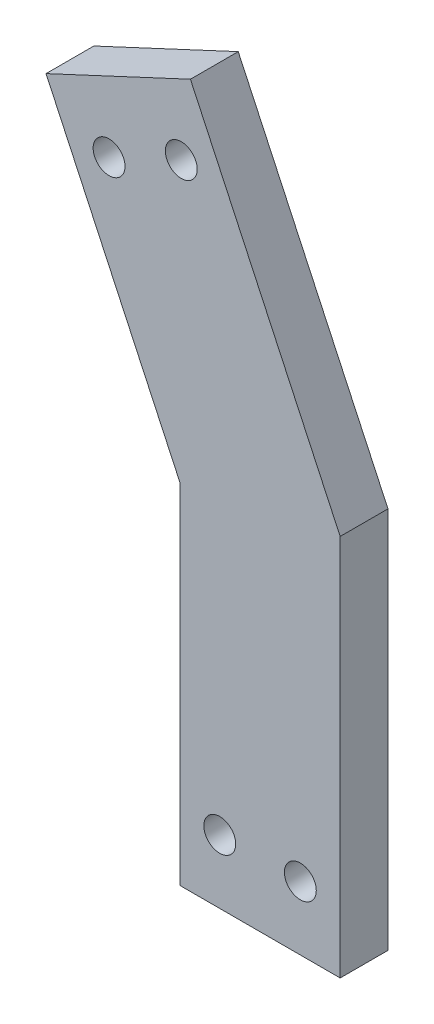
ISO-10303-21;
HEADER;
FILE_DESCRIPTION(('STEP AP214'),'2;1');
FILE_NAME('part.step','',(''),(''),'','','');
FILE_SCHEMA(('AUTOMOTIVE_DESIGN { 1 0 10303 214 1 1 1 1 }'));
ENDSEC;
DATA;
#1=APPLICATION_CONTEXT('core data for automotive mechanical design processes');
#2=APPLICATION_PROTOCOL_DEFINITION('international standard','automotive_design',2000,#1);
#3=PRODUCT_CONTEXT('',#1,'mechanical');
#4=PRODUCT('Part','Part','',(#3));
#5=PRODUCT_RELATED_PRODUCT_CATEGORY('part','',(#4));
#6=PRODUCT_DEFINITION_FORMATION('','',#4);
#7=PRODUCT_DEFINITION_CONTEXT('part definition',#1,'design');
#8=PRODUCT_DEFINITION('design','',#6,#7);
#9=PRODUCT_DEFINITION_SHAPE('','',#8);
#10=(LENGTH_UNIT() NAMED_UNIT(*) SI_UNIT(.MILLI.,.METRE.));
#11=(NAMED_UNIT(*) PLANE_ANGLE_UNIT() SI_UNIT($,.RADIAN.));
#12=(NAMED_UNIT(*) SI_UNIT($,.STERADIAN.) SOLID_ANGLE_UNIT());
#13=UNCERTAINTY_MEASURE_WITH_UNIT(LENGTH_MEASURE(1.E-05),#10,'distance_accuracy_value','');
#14=(GEOMETRIC_REPRESENTATION_CONTEXT(3) GLOBAL_UNCERTAINTY_ASSIGNED_CONTEXT((#13)) GLOBAL_UNIT_ASSIGNED_CONTEXT((#10,
#11,#12)) REPRESENTATION_CONTEXT('',''));
#15=CARTESIAN_POINT('',(0.,0.,0.));
#16=DIRECTION('',(0.,0.,1.));
#17=DIRECTION('',(1.,0.,0.));
#18=AXIS2_PLACEMENT_3D('',#15,#16,#17);
#19=CARTESIAN_POINT('',(0.,0.,7.5));
#20=DIRECTION('',(0.,0.,1.));
#21=DIRECTION('',(1.,0.,0.));
#22=AXIS2_PLACEMENT_3D('',#19,#20,#21);
#23=PLANE('',#22);
#24=CARTESIAN_POINT('',(4.182454481735,-45.1920906060583,7.5));
#25=DIRECTION('',(0.,0.,1.));
#26=DIRECTION('',(1.,0.,0.));
#27=AXIS2_PLACEMENT_3D('',#24,#25,#26);
#28=CIRCLE('',#27,2.49999999999998);
#29=CARTESIAN_POINT('',(6.68245448173498,-45.1920906060583,7.5));
#30=VERTEX_POINT('',#29);
#31=EDGE_CURVE('E212',#30,#30,#28,.T.);
#32=ORIENTED_EDGE('',*,*,#31,.F.);
#33=EDGE_LOOP('',(#32));
#34=FACE_BOUND('',#33,.T.);
#35=CARTESIAN_POINT('',(-13.1855058261115,38.2049203280538,7.5));
#36=DIRECTION('',(0.,0.,1.));
#37=DIRECTION('',(1.,0.,0.));
#38=AXIS2_PLACEMENT_3D('',#35,#36,#37);
#39=CIRCLE('',#38,2.5);
#40=CARTESIAN_POINT('',(-10.6855058261115,38.2049203280538,7.5));
#41=VERTEX_POINT('',#40);
#42=EDGE_CURVE('E134',#41,#41,#39,.T.);
#43=ORIENTED_EDGE('',*,*,#42,.F.);
#44=EDGE_LOOP('',(#43));
#45=FACE_BOUND('',#44,.T.);
#46=DIRECTION('',(1.,0.,0.));
#47=VECTOR('',#46,1.);
#48=CARTESIAN_POINT('',(-2.06754551826496,-55.1920906060583,7.5));
#49=LINE('',#48,#47);
#50=CARTESIAN_POINT('',(-2.06754551826496,-55.1920906060583,7.5));
#51=VERTEX_POINT('',#50);
#52=CARTESIAN_POINT('',(23.0761121124975,-55.1920906060583,7.5));
#53=VERTEX_POINT('',#52);
#54=EDGE_CURVE('E146',#51,#53,#49,.T.);
#55=ORIENTED_EDGE('',*,*,#54,.T.);
#56=DIRECTION('',(0.,1.,0.));
#57=VECTOR('',#56,1.);
#58=CARTESIAN_POINT('',(23.0761121124975,-55.1920906060583,7.5));
#59=LINE('',#58,#57);
#60=CARTESIAN_POINT('',(23.0761121124974,4.80790939394173,7.5));
#61=VERTEX_POINT('',#60);
#62=EDGE_CURVE('E94',#53,#61,#59,.T.);
#63=ORIENTED_EDGE('',*,*,#62,.T.);
#64=DIRECTION('',(-0.422618261740691,0.906307787036654,0.));
#65=VECTOR('',#64,1.);
#66=CARTESIAN_POINT('',(23.0761121124974,4.80790939394173,7.5));
#67=LINE('',#66,#65);
#68=CARTESIAN_POINT('',(-0.418417436581123,55.1920906060583,7.5));
#69=VERTEX_POINT('',#68);
#70=EDGE_CURVE('E107',#61,#69,#67,.T.);
#71=ORIENTED_EDGE('',*,*,#70,.T.);
#72=DIRECTION('',(-0.906307787036654,-0.42261826174069,0.));
#73=VECTOR('',#72,1.);
#74=CARTESIAN_POINT('',(-0.418417436581123,55.1920906060583,7.5));
#75=LINE('',#74,#73);
#76=CARTESIAN_POINT('',(-23.0761121124975,44.626634062541,7.5));
#77=VERTEX_POINT('',#76);
#78=EDGE_CURVE('E101',#69,#77,#75,.T.);
#79=ORIENTED_EDGE('',*,*,#78,.T.);
#80=DIRECTION('',(0.422618261740691,-0.906307787036654,0.));
#81=VECTOR('',#80,1.);
#82=CARTESIAN_POINT('',(-23.0761121124975,44.626634062541,7.5));
#83=LINE('',#82,#81);
#84=CARTESIAN_POINT('',(-2.06754551826498,-0.42638238877761,7.5));
#85=VERTEX_POINT('',#84);
#86=EDGE_CURVE('E105',#77,#85,#83,.T.);
#87=ORIENTED_EDGE('',*,*,#86,.T.);
#88=DIRECTION('',(0.,-1.,0.));
#89=VECTOR('',#88,1.);
#90=CARTESIAN_POINT('',(-2.06754551826498,-0.42638238877761,7.5));
#91=LINE('',#90,#89);
#92=EDGE_CURVE('E57',#85,#51,#91,.T.);
#93=ORIENTED_EDGE('',*,*,#92,.T.);
#94=EDGE_LOOP('',(#55,#63,#71,#79,#87,#93));
#95=FACE_BOUND('',#94,.T.);
#96=CARTESIAN_POINT('',(-1.85665848815333,43.4876485998125,7.5));
#97=DIRECTION('',(0.,0.,1.));
#98=DIRECTION('',(1.,0.,0.));
#99=AXIS2_PLACEMENT_3D('',#96,#97,#98);
#100=CIRCLE('',#99,2.5);
#101=CARTESIAN_POINT('',(0.643341511846661,43.4876485998125,7.5));
#102=VERTEX_POINT('',#101);
#103=EDGE_CURVE('E220',#102,#102,#100,.T.);
#104=ORIENTED_EDGE('',*,*,#103,.F.);
#105=EDGE_LOOP('',(#104));
#106=FACE_BOUND('',#105,.T.);
#107=CARTESIAN_POINT('',(16.8261121124975,-45.1920906060583,7.5));
#108=DIRECTION('',(0.,0.,1.));
#109=DIRECTION('',(1.,0.,0.));
#110=AXIS2_PLACEMENT_3D('',#107,#108,#109);
#111=CIRCLE('',#110,2.5);
#112=CARTESIAN_POINT('',(19.3261121124975,-45.1920906060583,7.5));
#113=VERTEX_POINT('',#112);
#114=EDGE_CURVE('E201',#113,#113,#111,.T.);
#115=ORIENTED_EDGE('',*,*,#114,.F.);
#116=EDGE_LOOP('',(#115));
#117=FACE_BOUND('',#116,.T.);
#118=ADVANCED_FACE('F39',(#34,#45,#95,#106,#117),#23,.T.);
#119=CARTESIAN_POINT('',(0.,0.,0.));
#120=DIRECTION('',(0.,0.,1.));
#121=DIRECTION('',(1.,0.,0.));
#122=AXIS2_PLACEMENT_3D('',#119,#120,#121);
#123=PLANE('',#122);
#124=DIRECTION('',(1.,0.,0.));
#125=VECTOR('',#124,1.);
#126=CARTESIAN_POINT('',(-2.06754551826496,-55.1920906060583,0.));
#127=LINE('',#126,#125);
#128=CARTESIAN_POINT('',(-2.06754551826496,-55.1920906060583,0.));
#129=VERTEX_POINT('',#128);
#130=CARTESIAN_POINT('',(23.0761121124975,-55.1920906060583,0.));
#131=VERTEX_POINT('',#130);
#132=EDGE_CURVE('E129',#129,#131,#127,.T.);
#133=ORIENTED_EDGE('',*,*,#132,.F.);
#134=DIRECTION('',(0.,-1.,0.));
#135=VECTOR('',#134,1.);
#136=CARTESIAN_POINT('',(-2.06754551826498,-0.42638238877761,0.));
#137=LINE('',#136,#135);
#138=CARTESIAN_POINT('',(-2.06754551826498,-0.42638238877761,0.));
#139=VERTEX_POINT('',#138);
#140=EDGE_CURVE('E86',#139,#129,#137,.T.);
#141=ORIENTED_EDGE('',*,*,#140,.F.);
#142=DIRECTION('',(0.422618261740691,-0.906307787036654,0.));
#143=VECTOR('',#142,1.);
#144=CARTESIAN_POINT('',(-23.0761121124975,44.626634062541,0.));
#145=LINE('',#144,#143);
#146=CARTESIAN_POINT('',(-23.0761121124975,44.626634062541,0.));
#147=VERTEX_POINT('',#146);
#148=EDGE_CURVE('E80',#147,#139,#145,.T.);
#149=ORIENTED_EDGE('',*,*,#148,.F.);
#150=DIRECTION('',(-0.906307787036654,-0.42261826174069,0.));
#151=VECTOR('',#150,1.);
#152=CARTESIAN_POINT('',(-0.418417436581123,55.1920906060583,0.));
#153=LINE('',#152,#151);
#154=CARTESIAN_POINT('',(-0.418417436581123,55.1920906060583,0.));
#155=VERTEX_POINT('',#154);
#156=EDGE_CURVE('E116',#155,#147,#153,.T.);
#157=ORIENTED_EDGE('',*,*,#156,.F.);
#158=DIRECTION('',(-0.422618261740691,0.906307787036654,0.));
#159=VECTOR('',#158,1.);
#160=CARTESIAN_POINT('',(23.0761121124974,4.80790939394173,0.));
#161=LINE('',#160,#159);
#162=CARTESIAN_POINT('',(23.0761121124974,4.80790939394173,0.));
#163=VERTEX_POINT('',#162);
#164=EDGE_CURVE('E137',#163,#155,#161,.T.);
#165=ORIENTED_EDGE('',*,*,#164,.F.);
#166=DIRECTION('',(0.,1.,0.));
#167=VECTOR('',#166,1.);
#168=CARTESIAN_POINT('',(23.0761121124975,-55.1920906060583,0.));
#169=LINE('',#168,#167);
#170=EDGE_CURVE('E133',#131,#163,#169,.T.);
#171=ORIENTED_EDGE('',*,*,#170,.F.);
#172=EDGE_LOOP('',(#133,#141,#149,#157,#165,#171));
#173=FACE_BOUND('',#172,.T.);
#174=CARTESIAN_POINT('',(-13.1855058261115,38.2049203280538,0.));
#175=DIRECTION('',(0.,0.,1.));
#176=DIRECTION('',(1.,0.,0.));
#177=AXIS2_PLACEMENT_3D('',#174,#175,#176);
#178=CIRCLE('',#177,2.5);
#179=CARTESIAN_POINT('',(-10.6855058261115,38.2049203280538,0.));
#180=VERTEX_POINT('',#179);
#181=EDGE_CURVE('E224',#180,#180,#178,.T.);
#182=ORIENTED_EDGE('',*,*,#181,.T.);
#183=EDGE_LOOP('',(#182));
#184=FACE_BOUND('',#183,.T.);
#185=CARTESIAN_POINT('',(-1.85665848815333,43.4876485998125,0.));
#186=DIRECTION('',(0.,0.,1.));
#187=DIRECTION('',(1.,0.,0.));
#188=AXIS2_PLACEMENT_3D('',#185,#186,#187);
#189=CIRCLE('',#188,2.5);
#190=CARTESIAN_POINT('',(0.643341511846661,43.4876485998125,0.));
#191=VERTEX_POINT('',#190);
#192=EDGE_CURVE('E216',#191,#191,#189,.T.);
#193=ORIENTED_EDGE('',*,*,#192,.T.);
#194=EDGE_LOOP('',(#193));
#195=FACE_BOUND('',#194,.T.);
#196=CARTESIAN_POINT('',(4.182454481735,-45.1920906060583,0.));
#197=DIRECTION('',(0.,0.,1.));
#198=DIRECTION('',(1.,0.,0.));
#199=AXIS2_PLACEMENT_3D('',#196,#197,#198);
#200=CIRCLE('',#199,2.49999999999998);
#201=CARTESIAN_POINT('',(6.68245448173498,-45.1920906060583,0.));
#202=VERTEX_POINT('',#201);
#203=EDGE_CURVE('E209',#202,#202,#200,.T.);
#204=ORIENTED_EDGE('',*,*,#203,.T.);
#205=EDGE_LOOP('',(#204));
#206=FACE_BOUND('',#205,.T.);
#207=CARTESIAN_POINT('',(16.8261121124975,-45.1920906060583,0.));
#208=DIRECTION('',(0.,0.,1.));
#209=DIRECTION('',(1.,0.,0.));
#210=AXIS2_PLACEMENT_3D('',#207,#208,#209);
#211=CIRCLE('',#210,2.5);
#212=CARTESIAN_POINT('',(19.3261121124975,-45.1920906060583,0.));
#213=VERTEX_POINT('',#212);
#214=EDGE_CURVE('E204',#213,#213,#211,.T.);
#215=ORIENTED_EDGE('',*,*,#214,.T.);
#216=EDGE_LOOP('',(#215));
#217=FACE_BOUND('',#216,.T.);
#218=ADVANCED_FACE('F159',(#173,#184,#195,#206,#217),#123,.F.);
#219=CARTESIAN_POINT('',(-2.06754551826496,-55.1920906060583,7.5));
#220=DIRECTION('',(0.,1.,0.));
#221=DIRECTION('',(0.,0.,1.));
#222=AXIS2_PLACEMENT_3D('',#219,#220,#221);
#223=PLANE('',#222);
#224=ORIENTED_EDGE('',*,*,#132,.T.);
#225=DIRECTION('',(0.,0.,-1.));
#226=VECTOR('',#225,1.);
#227=CARTESIAN_POINT('',(23.0761121124975,-55.1920906060583,7.5));
#228=LINE('',#227,#226);
#229=EDGE_CURVE('E11',#53,#131,#228,.T.);
#230=ORIENTED_EDGE('',*,*,#229,.F.);
#231=ORIENTED_EDGE('',*,*,#54,.F.);
#232=DIRECTION('',(0.,0.,-1.));
#233=VECTOR('',#232,1.);
#234=CARTESIAN_POINT('',(-2.06754551826496,-55.1920906060583,7.5));
#235=LINE('',#234,#233);
#236=EDGE_CURVE('E125',#51,#129,#235,.T.);
#237=ORIENTED_EDGE('',*,*,#236,.T.);
#238=EDGE_LOOP('',(#224,#230,#231,#237));
#239=FACE_BOUND('',#238,.T.);
#240=ADVANCED_FACE('F41',(#239),#223,.F.);
#241=CARTESIAN_POINT('',(23.0761121124975,-55.1920906060583,7.5));
#242=DIRECTION('',(-1.,0.,0.));
#243=DIRECTION('',(0.,-1.,0.));
#244=AXIS2_PLACEMENT_3D('',#241,#242,#243);
#245=PLANE('',#244);
#246=ORIENTED_EDGE('',*,*,#170,.T.);
#247=DIRECTION('',(0.,0.,-1.));
#248=VECTOR('',#247,1.);
#249=CARTESIAN_POINT('',(23.0761121124974,4.80790939394173,7.5));
#250=LINE('',#249,#248);
#251=EDGE_CURVE('E49',#61,#163,#250,.T.);
#252=ORIENTED_EDGE('',*,*,#251,.F.);
#253=ORIENTED_EDGE('',*,*,#62,.F.);
#254=ORIENTED_EDGE('',*,*,#229,.T.);
#255=EDGE_LOOP('',(#246,#252,#253,#254));
#256=FACE_BOUND('',#255,.T.);
#257=ADVANCED_FACE('F288',(#256),#245,.F.);
#258=CARTESIAN_POINT('',(23.0761121124974,4.80790939394173,7.5));
#259=DIRECTION('',(-0.906307787036654,-0.422618261740691,0.));
#260=DIRECTION('',(0.422618261740691,-0.906307787036654,0.));
#261=AXIS2_PLACEMENT_3D('',#258,#259,#260);
#262=PLANE('',#261);
#263=ORIENTED_EDGE('',*,*,#164,.T.);
#264=DIRECTION('',(0.,0.,-1.));
#265=VECTOR('',#264,1.);
#266=CARTESIAN_POINT('',(-0.418417436581123,55.1920906060583,7.5));
#267=LINE('',#266,#265);
#268=EDGE_CURVE('E118',#69,#155,#267,.T.);
#269=ORIENTED_EDGE('',*,*,#268,.F.);
#270=ORIENTED_EDGE('',*,*,#70,.F.);
#271=ORIENTED_EDGE('',*,*,#251,.T.);
#272=EDGE_LOOP('',(#263,#269,#270,#271));
#273=FACE_BOUND('',#272,.T.);
#274=ADVANCED_FACE('F156',(#273),#262,.F.);
#275=CARTESIAN_POINT('',(-0.418417436581123,55.1920906060583,7.5));
#276=DIRECTION('',(0.42261826174069,-0.906307787036654,0.));
#277=DIRECTION('',(0.906307787036654,0.42261826174069,0.));
#278=AXIS2_PLACEMENT_3D('',#275,#276,#277);
#279=PLANE('',#278);
#280=ORIENTED_EDGE('',*,*,#156,.T.);
#281=DIRECTION('',(0.,0.,-1.));
#282=VECTOR('',#281,1.);
#283=CARTESIAN_POINT('',(-23.0761121124975,44.626634062541,7.5));
#284=LINE('',#283,#282);
#285=EDGE_CURVE('E113',#77,#147,#284,.T.);
#286=ORIENTED_EDGE('',*,*,#285,.F.);
#287=ORIENTED_EDGE('',*,*,#78,.F.);
#288=ORIENTED_EDGE('',*,*,#268,.T.);
#289=EDGE_LOOP('',(#280,#286,#287,#288));
#290=FACE_BOUND('',#289,.T.);
#291=ADVANCED_FACE('F114',(#290),#279,.F.);
#292=CARTESIAN_POINT('',(-23.0761121124975,44.626634062541,7.5));
#293=DIRECTION('',(0.906307787036654,0.422618261740691,0.));
#294=DIRECTION('',(-0.422618261740691,0.906307787036654,0.));
#295=AXIS2_PLACEMENT_3D('',#292,#293,#294);
#296=PLANE('',#295);
#297=ORIENTED_EDGE('',*,*,#148,.T.);
#298=DIRECTION('',(0.,0.,-1.));
#299=VECTOR('',#298,1.);
#300=CARTESIAN_POINT('',(-2.06754551826498,-0.42638238877761,7.5));
#301=LINE('',#300,#299);
#302=EDGE_CURVE('E119',#85,#139,#301,.T.);
#303=ORIENTED_EDGE('',*,*,#302,.F.);
#304=ORIENTED_EDGE('',*,*,#86,.F.);
#305=ORIENTED_EDGE('',*,*,#285,.T.);
#306=EDGE_LOOP('',(#297,#303,#304,#305));
#307=FACE_BOUND('',#306,.T.);
#308=ADVANCED_FACE('F121',(#307),#296,.F.);
#309=CARTESIAN_POINT('',(-2.06754551826498,-0.42638238877761,7.5));
#310=DIRECTION('',(1.,0.,0.));
#311=DIRECTION('',(0.,1.,0.));
#312=AXIS2_PLACEMENT_3D('',#309,#310,#311);
#313=PLANE('',#312);
#314=ORIENTED_EDGE('',*,*,#140,.T.);
#315=ORIENTED_EDGE('',*,*,#236,.F.);
#316=ORIENTED_EDGE('',*,*,#92,.F.);
#317=ORIENTED_EDGE('',*,*,#302,.T.);
#318=EDGE_LOOP('',(#314,#315,#316,#317));
#319=FACE_BOUND('',#318,.T.);
#320=ADVANCED_FACE('F164',(#319),#313,.F.);
#321=CARTESIAN_POINT('',(-13.1855058261115,38.2049203280538,7.5));
#322=DIRECTION('',(0.,0.,-1.));
#323=DIRECTION('',(-1.,0.,0.));
#324=AXIS2_PLACEMENT_3D('',#321,#322,#323);
#325=CYLINDRICAL_SURFACE('',#324,2.5);
#326=ORIENTED_EDGE('',*,*,#42,.T.);
#327=EDGE_LOOP('',(#326));
#328=FACE_BOUND('',#327,.T.);
#329=ORIENTED_EDGE('',*,*,#181,.F.);
#330=EDGE_LOOP('',(#329));
#331=FACE_BOUND('',#330,.T.);
#332=ADVANCED_FACE('F166',(#328,#331),#325,.F.);
#333=CARTESIAN_POINT('',(-1.85665848815333,43.4876485998125,7.5));
#334=DIRECTION('',(0.,0.,-1.));
#335=DIRECTION('',(-1.,0.,0.));
#336=AXIS2_PLACEMENT_3D('',#333,#334,#335);
#337=CYLINDRICAL_SURFACE('',#336,2.5);
#338=ORIENTED_EDGE('',*,*,#103,.T.);
#339=EDGE_LOOP('',(#338));
#340=FACE_BOUND('',#339,.T.);
#341=ORIENTED_EDGE('',*,*,#192,.F.);
#342=EDGE_LOOP('',(#341));
#343=FACE_BOUND('',#342,.T.);
#344=ADVANCED_FACE('F172',(#340,#343),#337,.F.);
#345=CARTESIAN_POINT('',(4.182454481735,-45.1920906060583,7.5));
#346=DIRECTION('',(0.,0.,-1.));
#347=DIRECTION('',(-1.,0.,0.));
#348=AXIS2_PLACEMENT_3D('',#345,#346,#347);
#349=CYLINDRICAL_SURFACE('',#348,2.49999999999998);
#350=ORIENTED_EDGE('',*,*,#31,.T.);
#351=EDGE_LOOP('',(#350));
#352=FACE_BOUND('',#351,.T.);
#353=ORIENTED_EDGE('',*,*,#203,.F.);
#354=EDGE_LOOP('',(#353));
#355=FACE_BOUND('',#354,.T.);
#356=ADVANCED_FACE('F188',(#352,#355),#349,.F.);
#357=CARTESIAN_POINT('',(16.8261121124975,-45.1920906060583,7.5));
#358=DIRECTION('',(0.,0.,-1.));
#359=DIRECTION('',(-1.,0.,0.));
#360=AXIS2_PLACEMENT_3D('',#357,#358,#359);
#361=CYLINDRICAL_SURFACE('',#360,2.5);
#362=ORIENTED_EDGE('',*,*,#114,.T.);
#363=EDGE_LOOP('',(#362));
#364=FACE_BOUND('',#363,.T.);
#365=ORIENTED_EDGE('',*,*,#214,.F.);
#366=EDGE_LOOP('',(#365));
#367=FACE_BOUND('',#366,.T.);
#368=ADVANCED_FACE('F192',(#364,#367),#361,.F.);
#369=CLOSED_SHELL('',(#118,#218,#240,#257,#274,#291,#308,#320,#332,#344,#356,#368));
#370=MANIFOLD_SOLID_BREP('B2',#369);
#371=ADVANCED_BREP_SHAPE_REPRESENTATION('',(#18,#370),#14);
#372=SHAPE_DEFINITION_REPRESENTATION(#9,#371);
ENDSEC;
END-ISO-10303-21;
